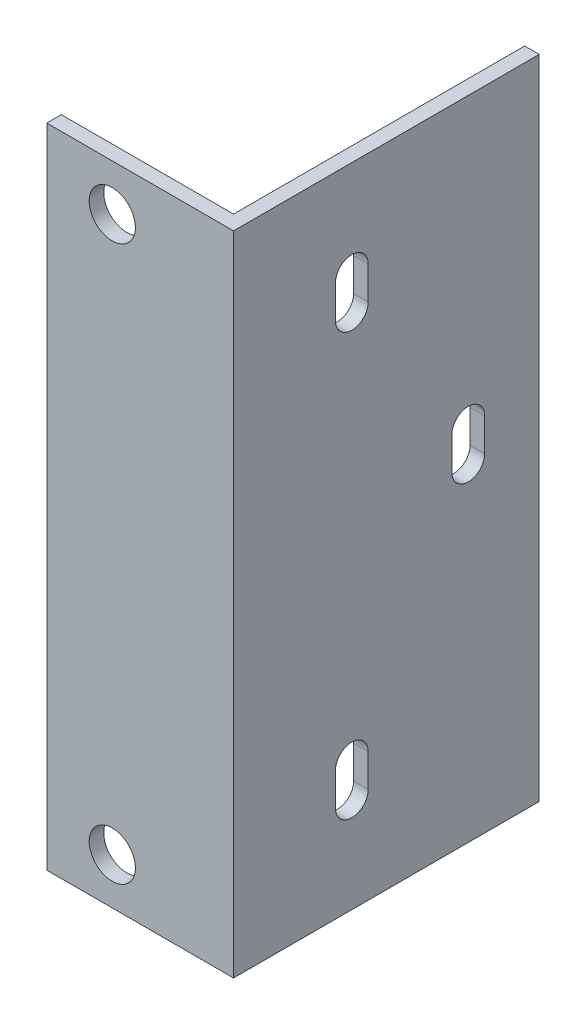
ISO-10303-21;
HEADER;
FILE_DESCRIPTION(('STEP AP214'),'2;1');
FILE_NAME('part.step','',(''),(''),'','','');
FILE_SCHEMA(('AUTOMOTIVE_DESIGN { 1 0 10303 214 1 1 1 1 }'));
ENDSEC;
DATA;
#1=APPLICATION_CONTEXT('core data for automotive mechanical design processes');
#2=APPLICATION_PROTOCOL_DEFINITION('international standard','automotive_design',2000,#1);
#3=PRODUCT_CONTEXT('',#1,'mechanical');
#4=PRODUCT('Part','Part','',(#3));
#5=PRODUCT_RELATED_PRODUCT_CATEGORY('part','',(#4));
#6=PRODUCT_DEFINITION_FORMATION('','',#4);
#7=PRODUCT_DEFINITION_CONTEXT('part definition',#1,'design');
#8=PRODUCT_DEFINITION('design','',#6,#7);
#9=PRODUCT_DEFINITION_SHAPE('','',#8);
#10=(LENGTH_UNIT() NAMED_UNIT(*) SI_UNIT(.MILLI.,.METRE.));
#11=(NAMED_UNIT(*) PLANE_ANGLE_UNIT() SI_UNIT($,.RADIAN.));
#12=(NAMED_UNIT(*) SI_UNIT($,.STERADIAN.) SOLID_ANGLE_UNIT());
#13=UNCERTAINTY_MEASURE_WITH_UNIT(LENGTH_MEASURE(1.E-05),#10,'distance_accuracy_value','');
#14=(GEOMETRIC_REPRESENTATION_CONTEXT(3) GLOBAL_UNCERTAINTY_ASSIGNED_CONTEXT((#13)) GLOBAL_UNIT_ASSIGNED_CONTEXT((#10,
#11,#12)) REPRESENTATION_CONTEXT('',''));
#15=CARTESIAN_POINT('',(0.,0.,0.));
#16=DIRECTION('',(0.,0.,1.));
#17=DIRECTION('',(1.,0.,0.));
#18=AXIS2_PLACEMENT_3D('',#15,#16,#17);
#19=CARTESIAN_POINT('',(0.,0.,-2.));
#20=DIRECTION('',(0.,0.,1.));
#21=DIRECTION('',(1.,0.,0.));
#22=AXIS2_PLACEMENT_3D('',#19,#20,#21);
#23=PLANE('',#22);
#24=CARTESIAN_POINT('',(0.,38.1,-2.));
#25=DIRECTION('',(0.,0.,1.));
#26=DIRECTION('',(1.,0.,0.));
#27=AXIS2_PLACEMENT_3D('',#24,#25,#26);
#28=CIRCLE('',#27,3.175);
#29=CARTESIAN_POINT('',(3.17500000000001,38.1,-2.));
#30=VERTEX_POINT('',#29);
#31=EDGE_CURVE('E267',#30,#30,#28,.F.);
#32=ORIENTED_EDGE('',*,*,#31,.F.);
#33=EDGE_LOOP('',(#32));
#34=FACE_BOUND('',#33,.T.);
#35=CARTESIAN_POINT('',(0.,-38.1,-2.));
#36=DIRECTION('',(0.,0.,1.));
#37=DIRECTION('',(1.,0.,0.));
#38=AXIS2_PLACEMENT_3D('',#35,#36,#37);
#39=CIRCLE('',#38,3.175);
#40=CARTESIAN_POINT('',(3.17500000000001,-38.1,-2.));
#41=VERTEX_POINT('',#40);
#42=EDGE_CURVE('E270',#41,#41,#39,.T.);
#43=ORIENTED_EDGE('',*,*,#42,.T.);
#44=EDGE_LOOP('',(#43));
#45=FACE_BOUND('',#44,.T.);
#46=DIRECTION('',(0.,1.,0.));
#47=VECTOR('',#46,1.);
#48=CARTESIAN_POINT('',(14.6624,44.45,-2.));
#49=LINE('',#48,#47);
#50=CARTESIAN_POINT('',(14.6624,-44.45,-2.));
#51=VERTEX_POINT('',#50);
#52=CARTESIAN_POINT('',(14.6624,44.45,-2.));
#53=VERTEX_POINT('',#52);
#54=EDGE_CURVE('E198',#51,#53,#49,.T.);
#55=ORIENTED_EDGE('',*,*,#54,.F.);
#56=DIRECTION('',(1.,0.,0.));
#57=VECTOR('',#56,1.);
#58=CARTESIAN_POINT('',(0.,-44.45,-2.));
#59=LINE('',#58,#57);
#60=CARTESIAN_POINT('',(-8.99999999999998,-44.45,-2.));
#61=VERTEX_POINT('',#60);
#62=EDGE_CURVE('E264',#61,#51,#59,.T.);
#63=ORIENTED_EDGE('',*,*,#62,.F.);
#64=DIRECTION('',(0.,-1.,0.));
#65=VECTOR('',#64,1.);
#66=CARTESIAN_POINT('',(-8.99999999999998,0.,-2.));
#67=LINE('',#66,#65);
#68=CARTESIAN_POINT('',(-8.99999999999999,44.45,-2.));
#69=VERTEX_POINT('',#68);
#70=EDGE_CURVE('E258',#69,#61,#67,.T.);
#71=ORIENTED_EDGE('',*,*,#70,.F.);
#72=DIRECTION('',(1.,0.,0.));
#73=VECTOR('',#72,1.);
#74=CARTESIAN_POINT('',(0.,44.45,-2.));
#75=LINE('',#74,#73);
#76=EDGE_CURVE('E259',#69,#53,#75,.T.);
#77=ORIENTED_EDGE('',*,*,#76,.T.);
#78=EDGE_LOOP('',(#55,#63,#71,#77));
#79=FACE_BOUND('',#78,.T.);
#80=ADVANCED_FACE('F43',(#34,#45,#79),#23,.F.);
#81=CARTESIAN_POINT('',(16.6624,0.,-2.));
#82=DIRECTION('',(-1.,0.,0.));
#83=DIRECTION('',(0.,-1.,0.));
#84=AXIS2_PLACEMENT_3D('',#81,#82,#83);
#85=PLANE('',#84);
#86=DIRECTION('',(0.,1.,0.));
#87=VECTOR('',#86,1.);
#88=CARTESIAN_POINT('',(16.6624,26.75,-18.5));
#89=LINE('',#88,#87);
#90=CARTESIAN_POINT('',(16.6624,26.75,-18.5));
#91=VERTEX_POINT('',#90);
#92=CARTESIAN_POINT('',(16.6624,31.25,-18.5));
#93=VERTEX_POINT('',#92);
#94=EDGE_CURVE('E184',#91,#93,#89,.T.);
#95=ORIENTED_EDGE('',*,*,#94,.F.);
#96=CARTESIAN_POINT('',(16.6624,26.75,-16.25));
#97=DIRECTION('',(1.,0.,0.));
#98=DIRECTION('',(0.,-1.,0.));
#99=AXIS2_PLACEMENT_3D('',#96,#97,#98);
#100=CIRCLE('',#99,2.25);
#101=CARTESIAN_POINT('',(16.6624,26.75,-14.));
#102=VERTEX_POINT('',#101);
#103=EDGE_CURVE('E59',#102,#91,#100,.T.);
#104=ORIENTED_EDGE('',*,*,#103,.F.);
#105=DIRECTION('',(0.,-1.,0.));
#106=VECTOR('',#105,1.);
#107=CARTESIAN_POINT('',(16.6624,26.75,-14.));
#108=LINE('',#107,#106);
#109=CARTESIAN_POINT('',(16.6624,31.25,-14.));
#110=VERTEX_POINT('',#109);
#111=EDGE_CURVE('E192',#110,#102,#108,.T.);
#112=ORIENTED_EDGE('',*,*,#111,.F.);
#113=CARTESIAN_POINT('',(16.6624,31.25,-16.25));
#114=DIRECTION('',(1.,0.,0.));
#115=DIRECTION('',(0.,-1.,0.));
#116=AXIS2_PLACEMENT_3D('',#113,#114,#115);
#117=CIRCLE('',#116,2.25);
#118=EDGE_CURVE('E174',#93,#110,#117,.T.);
#119=ORIENTED_EDGE('',*,*,#118,.F.);
#120=EDGE_LOOP('',(#95,#104,#112,#119));
#121=FACE_BOUND('',#120,.T.);
#122=DIRECTION('',(0.,-1.,0.));
#123=VECTOR('',#122,1.);
#124=CARTESIAN_POINT('',(16.6624,5.19999999999998,-30.));
#125=LINE('',#124,#123);
#126=CARTESIAN_POINT('',(16.6624,5.19999999999998,-30.));
#127=VERTEX_POINT('',#126);
#128=CARTESIAN_POINT('',(16.6624,0.699999999999978,-30.));
#129=VERTEX_POINT('',#128);
#130=EDGE_CURVE('E217',#127,#129,#125,.T.);
#131=ORIENTED_EDGE('',*,*,#130,.F.);
#132=CARTESIAN_POINT('',(16.6624,5.2,-32.25));
#133=DIRECTION('',(1.,0.,0.));
#134=DIRECTION('',(0.,1.,0.));
#135=AXIS2_PLACEMENT_3D('',#132,#133,#134);
#136=CIRCLE('',#135,2.25);
#137=CARTESIAN_POINT('',(16.6624,5.2,-34.5));
#138=VERTEX_POINT('',#137);
#139=EDGE_CURVE('E67',#138,#127,#136,.T.);
#140=ORIENTED_EDGE('',*,*,#139,.F.);
#141=DIRECTION('',(0.,1.,0.));
#142=VECTOR('',#141,1.);
#143=CARTESIAN_POINT('',(16.6624,5.2,-34.5));
#144=LINE('',#143,#142);
#145=CARTESIAN_POINT('',(16.6624,0.699999999999994,-34.5));
#146=VERTEX_POINT('',#145);
#147=EDGE_CURVE('E201',#146,#138,#144,.T.);
#148=ORIENTED_EDGE('',*,*,#147,.F.);
#149=CARTESIAN_POINT('',(16.6624,0.699999999999994,-32.25));
#150=DIRECTION('',(1.,0.,0.));
#151=DIRECTION('',(0.,1.,0.));
#152=AXIS2_PLACEMENT_3D('',#149,#150,#151);
#153=CIRCLE('',#152,2.25);
#154=EDGE_CURVE('E214',#129,#146,#153,.T.);
#155=ORIENTED_EDGE('',*,*,#154,.F.);
#156=EDGE_LOOP('',(#131,#140,#148,#155));
#157=FACE_BOUND('',#156,.T.);
#158=DIRECTION('',(0.,-1.,0.));
#159=VECTOR('',#158,1.);
#160=CARTESIAN_POINT('',(16.6624,-26.75,-14.));
#161=LINE('',#160,#159);
#162=CARTESIAN_POINT('',(16.6624,-26.75,-14.));
#163=VERTEX_POINT('',#162);
#164=CARTESIAN_POINT('',(16.6624,-31.25,-14.));
#165=VERTEX_POINT('',#164);
#166=EDGE_CURVE('E232',#163,#165,#161,.T.);
#167=ORIENTED_EDGE('',*,*,#166,.F.);
#168=CARTESIAN_POINT('',(16.6624,-26.75,-16.25));
#169=DIRECTION('',(1.,0.,0.));
#170=DIRECTION('',(0.,1.,0.));
#171=AXIS2_PLACEMENT_3D('',#168,#169,#170);
#172=CIRCLE('',#171,2.25);
#173=CARTESIAN_POINT('',(16.6624,-26.75,-18.5));
#174=VERTEX_POINT('',#173);
#175=EDGE_CURVE('E208',#174,#163,#172,.T.);
#176=ORIENTED_EDGE('',*,*,#175,.F.);
#177=DIRECTION('',(0.,1.,0.));
#178=VECTOR('',#177,1.);
#179=CARTESIAN_POINT('',(16.6624,-26.75,-18.5));
#180=LINE('',#179,#178);
#181=CARTESIAN_POINT('',(16.6624,-31.25,-18.5));
#182=VERTEX_POINT('',#181);
#183=EDGE_CURVE('E221',#182,#174,#180,.T.);
#184=ORIENTED_EDGE('',*,*,#183,.F.);
#185=CARTESIAN_POINT('',(16.6624,-31.25,-16.25));
#186=DIRECTION('',(1.,0.,0.));
#187=DIRECTION('',(0.,1.,0.));
#188=AXIS2_PLACEMENT_3D('',#185,#186,#187);
#189=CIRCLE('',#188,2.25);
#190=EDGE_CURVE('E235',#165,#182,#189,.T.);
#191=ORIENTED_EDGE('',*,*,#190,.F.);
#192=EDGE_LOOP('',(#167,#176,#184,#191));
#193=FACE_BOUND('',#192,.T.);
#194=DIRECTION('',(0.,-1.,0.));
#195=VECTOR('',#194,1.);
#196=CARTESIAN_POINT('',(16.6624,0.,0.));
#197=LINE('',#196,#195);
#198=CARTESIAN_POINT('',(16.6624,44.45,0.));
#199=VERTEX_POINT('',#198);
#200=CARTESIAN_POINT('',(16.6624,-44.45,0.));
#201=VERTEX_POINT('',#200);
#202=EDGE_CURVE('E260',#199,#201,#197,.T.);
#203=ORIENTED_EDGE('',*,*,#202,.T.);
#204=DIRECTION('',(0.,0.,1.));
#205=VECTOR('',#204,1.);
#206=CARTESIAN_POINT('',(16.6624,-44.45,-2.));
#207=LINE('',#206,#205);
#208=CARTESIAN_POINT('',(16.6624,-44.45,-42.));
#209=VERTEX_POINT('',#208);
#210=EDGE_CURVE('E289',#209,#201,#207,.T.);
#211=ORIENTED_EDGE('',*,*,#210,.F.);
#212=DIRECTION('',(0.,-1.,0.));
#213=VECTOR('',#212,1.);
#214=CARTESIAN_POINT('',(16.6624,44.45,-42.));
#215=LINE('',#214,#213);
#216=CARTESIAN_POINT('',(16.6624,44.45,-42.));
#217=VERTEX_POINT('',#216);
#218=EDGE_CURVE('E237',#217,#209,#215,.T.);
#219=ORIENTED_EDGE('',*,*,#218,.F.);
#220=DIRECTION('',(0.,0.,1.));
#221=VECTOR('',#220,1.);
#222=CARTESIAN_POINT('',(16.6624,44.45,-2.));
#223=LINE('',#222,#221);
#224=EDGE_CURVE('E271',#217,#199,#223,.T.);
#225=ORIENTED_EDGE('',*,*,#224,.T.);
#226=EDGE_LOOP('',(#203,#211,#219,#225));
#227=FACE_BOUND('',#226,.T.);
#228=ADVANCED_FACE('F44',(#121,#157,#193,#227),#85,.F.);
#229=CARTESIAN_POINT('',(0.,-44.45,-2.));
#230=DIRECTION('',(0.,-1.,0.));
#231=DIRECTION('',(1.,0.,0.));
#232=AXIS2_PLACEMENT_3D('',#229,#230,#231);
#233=PLANE('',#232);
#234=DIRECTION('',(1.,0.,0.));
#235=VECTOR('',#234,1.);
#236=CARTESIAN_POINT('',(0.,-44.45,0.));
#237=LINE('',#236,#235);
#238=CARTESIAN_POINT('',(-8.99999999999998,-44.45,0.));
#239=VERTEX_POINT('',#238);
#240=EDGE_CURVE('E282',#239,#201,#237,.T.);
#241=ORIENTED_EDGE('',*,*,#240,.F.);
#242=DIRECTION('',(0.,0.,1.));
#243=VECTOR('',#242,1.);
#244=CARTESIAN_POINT('',(-8.99999999999998,-44.45,-2.));
#245=LINE('',#244,#243);
#246=EDGE_CURVE('E292',#61,#239,#245,.T.);
#247=ORIENTED_EDGE('',*,*,#246,.F.);
#248=ORIENTED_EDGE('',*,*,#62,.T.);
#249=DIRECTION('',(0.,0.,1.));
#250=VECTOR('',#249,1.);
#251=CARTESIAN_POINT('',(14.6624,-44.45,-42.));
#252=LINE('',#251,#250);
#253=CARTESIAN_POINT('',(14.6624,-44.45,-42.));
#254=VERTEX_POINT('',#253);
#255=EDGE_CURVE('E251',#254,#51,#252,.T.);
#256=ORIENTED_EDGE('',*,*,#255,.F.);
#257=DIRECTION('',(-1.,0.,0.));
#258=VECTOR('',#257,1.);
#259=CARTESIAN_POINT('',(16.6624,-44.45,-42.));
#260=LINE('',#259,#258);
#261=EDGE_CURVE('E245',#209,#254,#260,.T.);
#262=ORIENTED_EDGE('',*,*,#261,.F.);
#263=ORIENTED_EDGE('',*,*,#210,.T.);
#264=EDGE_LOOP('',(#241,#247,#248,#256,#262,#263));
#265=FACE_BOUND('',#264,.T.);
#266=ADVANCED_FACE('F355',(#265),#233,.T.);
#267=CARTESIAN_POINT('',(-8.99999999999998,0.,-2.));
#268=DIRECTION('',(-1.,0.,0.));
#269=DIRECTION('',(0.,-1.,0.));
#270=AXIS2_PLACEMENT_3D('',#267,#268,#269);
#271=PLANE('',#270);
#272=DIRECTION('',(0.,-1.,0.));
#273=VECTOR('',#272,1.);
#274=CARTESIAN_POINT('',(-8.99999999999998,0.,0.));
#275=LINE('',#274,#273);
#276=CARTESIAN_POINT('',(-8.99999999999999,44.45,0.));
#277=VERTEX_POINT('',#276);
#278=EDGE_CURVE('E279',#277,#239,#275,.T.);
#279=ORIENTED_EDGE('',*,*,#278,.F.);
#280=DIRECTION('',(0.,0.,1.));
#281=VECTOR('',#280,1.);
#282=CARTESIAN_POINT('',(-8.99999999999999,44.45,-2.));
#283=LINE('',#282,#281);
#284=EDGE_CURVE('E295',#69,#277,#283,.T.);
#285=ORIENTED_EDGE('',*,*,#284,.F.);
#286=ORIENTED_EDGE('',*,*,#70,.T.);
#287=ORIENTED_EDGE('',*,*,#246,.T.);
#288=EDGE_LOOP('',(#279,#285,#286,#287));
#289=FACE_BOUND('',#288,.T.);
#290=ADVANCED_FACE('F367',(#289),#271,.T.);
#291=CARTESIAN_POINT('',(0.,-38.1,-2.));
#292=DIRECTION('',(0.,0.,1.));
#293=DIRECTION('',(1.,0.,0.));
#294=AXIS2_PLACEMENT_3D('',#291,#292,#293);
#295=CYLINDRICAL_SURFACE('',#294,3.175);
#296=ORIENTED_EDGE('',*,*,#42,.F.);
#297=EDGE_LOOP('',(#296));
#298=FACE_BOUND('',#297,.T.);
#299=CARTESIAN_POINT('',(0.,-38.1,0.));
#300=DIRECTION('',(0.,0.,1.));
#301=DIRECTION('',(1.,0.,0.));
#302=AXIS2_PLACEMENT_3D('',#299,#300,#301);
#303=CIRCLE('',#302,3.175);
#304=CARTESIAN_POINT('',(3.17500000000001,-38.1,0.));
#305=VERTEX_POINT('',#304);
#306=EDGE_CURVE('E284',#305,#305,#303,.T.);
#307=ORIENTED_EDGE('',*,*,#306,.T.);
#308=EDGE_LOOP('',(#307));
#309=FACE_BOUND('',#308,.T.);
#310=ADVANCED_FACE('F366',(#298,#309),#295,.F.);
#311=CARTESIAN_POINT('',(0.,44.45,-2.));
#312=DIRECTION('',(0.,-1.,0.));
#313=DIRECTION('',(1.,0.,0.));
#314=AXIS2_PLACEMENT_3D('',#311,#312,#313);
#315=PLANE('',#314);
#316=DIRECTION('',(1.,0.,0.));
#317=VECTOR('',#316,1.);
#318=CARTESIAN_POINT('',(0.,44.45,0.));
#319=LINE('',#318,#317);
#320=EDGE_CURVE('E277',#277,#199,#319,.T.);
#321=ORIENTED_EDGE('',*,*,#320,.T.);
#322=ORIENTED_EDGE('',*,*,#224,.F.);
#323=DIRECTION('',(1.,0.,0.));
#324=VECTOR('',#323,1.);
#325=CARTESIAN_POINT('',(16.6624,44.45,-42.));
#326=LINE('',#325,#324);
#327=CARTESIAN_POINT('',(14.6624,44.45,-42.));
#328=VERTEX_POINT('',#327);
#329=EDGE_CURVE('E246',#328,#217,#326,.T.);
#330=ORIENTED_EDGE('',*,*,#329,.F.);
#331=DIRECTION('',(0.,0.,1.));
#332=VECTOR('',#331,1.);
#333=CARTESIAN_POINT('',(14.6624,44.45,-42.));
#334=LINE('',#333,#332);
#335=EDGE_CURVE('E248',#328,#53,#334,.T.);
#336=ORIENTED_EDGE('',*,*,#335,.T.);
#337=ORIENTED_EDGE('',*,*,#76,.F.);
#338=ORIENTED_EDGE('',*,*,#284,.T.);
#339=EDGE_LOOP('',(#321,#322,#330,#336,#337,#338));
#340=FACE_BOUND('',#339,.T.);
#341=ADVANCED_FACE('F364',(#340),#315,.F.);
#342=CARTESIAN_POINT('',(0.,38.1,-2.));
#343=DIRECTION('',(0.,0.,1.));
#344=DIRECTION('',(1.,0.,0.));
#345=AXIS2_PLACEMENT_3D('',#342,#343,#344);
#346=CYLINDRICAL_SURFACE('',#345,3.175);
#347=ORIENTED_EDGE('',*,*,#31,.T.);
#348=EDGE_LOOP('',(#347));
#349=FACE_BOUND('',#348,.T.);
#350=CARTESIAN_POINT('',(0.,38.1,0.));
#351=DIRECTION('',(0.,0.,1.));
#352=DIRECTION('',(1.,0.,0.));
#353=AXIS2_PLACEMENT_3D('',#350,#351,#352);
#354=CIRCLE('',#353,3.175);
#355=CARTESIAN_POINT('',(3.17500000000001,38.1,0.));
#356=VERTEX_POINT('',#355);
#357=EDGE_CURVE('E262',#356,#356,#354,.F.);
#358=ORIENTED_EDGE('',*,*,#357,.F.);
#359=EDGE_LOOP('',(#358));
#360=FACE_BOUND('',#359,.T.);
#361=ADVANCED_FACE('F359',(#349,#360),#346,.F.);
#362=CARTESIAN_POINT('',(0.,0.,0.));
#363=DIRECTION('',(0.,0.,1.));
#364=DIRECTION('',(1.,0.,0.));
#365=AXIS2_PLACEMENT_3D('',#362,#363,#364);
#366=PLANE('',#365);
#367=ORIENTED_EDGE('',*,*,#202,.F.);
#368=ORIENTED_EDGE('',*,*,#320,.F.);
#369=ORIENTED_EDGE('',*,*,#278,.T.);
#370=ORIENTED_EDGE('',*,*,#240,.T.);
#371=EDGE_LOOP('',(#367,#368,#369,#370));
#372=FACE_BOUND('',#371,.T.);
#373=ORIENTED_EDGE('',*,*,#306,.F.);
#374=EDGE_LOOP('',(#373));
#375=FACE_BOUND('',#374,.T.);
#376=ORIENTED_EDGE('',*,*,#357,.T.);
#377=EDGE_LOOP('',(#376));
#378=FACE_BOUND('',#377,.T.);
#379=ADVANCED_FACE('F356',(#372,#375,#378),#366,.T.);
#380=CARTESIAN_POINT('',(14.6624,44.45,-42.));
#381=DIRECTION('',(1.,0.,0.));
#382=DIRECTION('',(0.,1.,0.));
#383=AXIS2_PLACEMENT_3D('',#380,#381,#382);
#384=PLANE('',#383);
#385=DIRECTION('',(0.,-1.,0.));
#386=VECTOR('',#385,1.);
#387=CARTESIAN_POINT('',(14.6624,44.45,-14.));
#388=LINE('',#387,#386);
#389=CARTESIAN_POINT('',(14.6624,31.25,-14.));
#390=VERTEX_POINT('',#389);
#391=CARTESIAN_POINT('',(14.6624,26.75,-14.));
#392=VERTEX_POINT('',#391);
#393=EDGE_CURVE('E51',#390,#392,#388,.T.);
#394=ORIENTED_EDGE('',*,*,#393,.T.);
#395=CARTESIAN_POINT('',(14.6624,26.75,-16.25));
#396=DIRECTION('',(1.,0.,0.));
#397=DIRECTION('',(0.,1.,0.));
#398=AXIS2_PLACEMENT_3D('',#395,#396,#397);
#399=CIRCLE('',#398,2.25);
#400=CARTESIAN_POINT('',(14.6624,26.75,-18.5));
#401=VERTEX_POINT('',#400);
#402=EDGE_CURVE('E11',#392,#401,#399,.T.);
#403=ORIENTED_EDGE('',*,*,#402,.T.);
#404=DIRECTION('',(0.,1.,0.));
#405=VECTOR('',#404,1.);
#406=CARTESIAN_POINT('',(14.6624,44.45,-18.5));
#407=LINE('',#406,#405);
#408=CARTESIAN_POINT('',(14.6624,31.25,-18.5));
#409=VERTEX_POINT('',#408);
#410=EDGE_CURVE('E322',#401,#409,#407,.T.);
#411=ORIENTED_EDGE('',*,*,#410,.T.);
#412=CARTESIAN_POINT('',(14.6624,31.25,-16.25));
#413=DIRECTION('',(1.,0.,0.));
#414=DIRECTION('',(0.,1.,0.));
#415=AXIS2_PLACEMENT_3D('',#412,#413,#414);
#416=CIRCLE('',#415,2.25);
#417=EDGE_CURVE('E178',#409,#390,#416,.T.);
#418=ORIENTED_EDGE('',*,*,#417,.T.);
#419=EDGE_LOOP('',(#394,#403,#411,#418));
#420=FACE_BOUND('',#419,.T.);
#421=DIRECTION('',(0.,1.,0.));
#422=VECTOR('',#421,1.);
#423=CARTESIAN_POINT('',(14.6624,44.45,-34.5));
#424=LINE('',#423,#422);
#425=CARTESIAN_POINT('',(14.6624,0.699999999999994,-34.5));
#426=VERTEX_POINT('',#425);
#427=CARTESIAN_POINT('',(14.6624,5.2,-34.5));
#428=VERTEX_POINT('',#427);
#429=EDGE_CURVE('E314',#426,#428,#424,.T.);
#430=ORIENTED_EDGE('',*,*,#429,.T.);
#431=CARTESIAN_POINT('',(14.6624,5.2,-32.25));
#432=DIRECTION('',(1.,0.,0.));
#433=DIRECTION('',(0.,1.,0.));
#434=AXIS2_PLACEMENT_3D('',#431,#432,#433);
#435=CIRCLE('',#434,2.25);
#436=CARTESIAN_POINT('',(14.6624,5.19999999999998,-30.));
#437=VERTEX_POINT('',#436);
#438=EDGE_CURVE('E319',#428,#437,#435,.T.);
#439=ORIENTED_EDGE('',*,*,#438,.T.);
#440=DIRECTION('',(0.,-1.,0.));
#441=VECTOR('',#440,1.);
#442=CARTESIAN_POINT('',(14.6624,44.45,-30.));
#443=LINE('',#442,#441);
#444=CARTESIAN_POINT('',(14.6624,0.699999999999978,-30.));
#445=VERTEX_POINT('',#444);
#446=EDGE_CURVE('E307',#437,#445,#443,.T.);
#447=ORIENTED_EDGE('',*,*,#446,.T.);
#448=CARTESIAN_POINT('',(14.6624,0.699999999999994,-32.25));
#449=DIRECTION('',(1.,0.,0.));
#450=DIRECTION('',(0.,1.,0.));
#451=AXIS2_PLACEMENT_3D('',#448,#449,#450);
#452=CIRCLE('',#451,2.25);
#453=EDGE_CURVE('E315',#445,#426,#452,.T.);
#454=ORIENTED_EDGE('',*,*,#453,.T.);
#455=EDGE_LOOP('',(#430,#439,#447,#454));
#456=FACE_BOUND('',#455,.T.);
#457=DIRECTION('',(0.,1.,0.));
#458=VECTOR('',#457,1.);
#459=CARTESIAN_POINT('',(14.6624,44.45,-18.5));
#460=LINE('',#459,#458);
#461=CARTESIAN_POINT('',(14.6624,-31.25,-18.5));
#462=VERTEX_POINT('',#461);
#463=CARTESIAN_POINT('',(14.6624,-26.75,-18.5));
#464=VERTEX_POINT('',#463);
#465=EDGE_CURVE('E303',#462,#464,#460,.T.);
#466=ORIENTED_EDGE('',*,*,#465,.T.);
#467=CARTESIAN_POINT('',(14.6624,-26.75,-16.25));
#468=DIRECTION('',(1.,0.,0.));
#469=DIRECTION('',(0.,1.,0.));
#470=AXIS2_PLACEMENT_3D('',#467,#468,#469);
#471=CIRCLE('',#470,2.25);
#472=CARTESIAN_POINT('',(14.6624,-26.75,-14.));
#473=VERTEX_POINT('',#472);
#474=EDGE_CURVE('E306',#464,#473,#471,.T.);
#475=ORIENTED_EDGE('',*,*,#474,.T.);
#476=DIRECTION('',(0.,-1.,0.));
#477=VECTOR('',#476,1.);
#478=CARTESIAN_POINT('',(14.6624,44.45,-14.));
#479=LINE('',#478,#477);
#480=CARTESIAN_POINT('',(14.6624,-31.25,-14.));
#481=VERTEX_POINT('',#480);
#482=EDGE_CURVE('E293',#473,#481,#479,.T.);
#483=ORIENTED_EDGE('',*,*,#482,.T.);
#484=CARTESIAN_POINT('',(14.6624,-31.25,-16.25));
#485=DIRECTION('',(1.,0.,0.));
#486=DIRECTION('',(0.,1.,0.));
#487=AXIS2_PLACEMENT_3D('',#484,#485,#486);
#488=CIRCLE('',#487,2.25);
#489=EDGE_CURVE('E297',#481,#462,#488,.T.);
#490=ORIENTED_EDGE('',*,*,#489,.T.);
#491=EDGE_LOOP('',(#466,#475,#483,#490));
#492=FACE_BOUND('',#491,.T.);
#493=ORIENTED_EDGE('',*,*,#54,.T.);
#494=ORIENTED_EDGE('',*,*,#335,.F.);
#495=DIRECTION('',(0.,1.,0.));
#496=VECTOR('',#495,1.);
#497=CARTESIAN_POINT('',(14.6624,44.45,-42.));
#498=LINE('',#497,#496);
#499=EDGE_CURVE('E242',#254,#328,#498,.T.);
#500=ORIENTED_EDGE('',*,*,#499,.F.);
#501=ORIENTED_EDGE('',*,*,#255,.T.);
#502=EDGE_LOOP('',(#493,#494,#500,#501));
#503=FACE_BOUND('',#502,.T.);
#504=ADVANCED_FACE('F323',(#420,#456,#492,#503),#384,.F.);
#505=CARTESIAN_POINT('',(0.,0.,-42.));
#506=DIRECTION('',(0.,0.,-1.));
#507=DIRECTION('',(-1.,0.,0.));
#508=AXIS2_PLACEMENT_3D('',#505,#506,#507);
#509=PLANE('',#508);
#510=ORIENTED_EDGE('',*,*,#218,.T.);
#511=ORIENTED_EDGE('',*,*,#261,.T.);
#512=ORIENTED_EDGE('',*,*,#499,.T.);
#513=ORIENTED_EDGE('',*,*,#329,.T.);
#514=EDGE_LOOP('',(#510,#511,#512,#513));
#515=FACE_BOUND('',#514,.T.);
#516=ADVANCED_FACE('F393',(#515),#509,.T.);
#517=CARTESIAN_POINT('',(-3.33759999999999,-26.75,-16.25));
#518=DIRECTION('',(1.,0.,0.));
#519=DIRECTION('',(0.,1.,0.));
#520=AXIS2_PLACEMENT_3D('',#517,#518,#519);
#521=CYLINDRICAL_SURFACE('',#520,2.25);
#522=DIRECTION('',(1.,0.,0.));
#523=VECTOR('',#522,1.);
#524=CARTESIAN_POINT('',(-3.33759999999999,-26.75,-18.5));
#525=LINE('',#524,#523);
#526=EDGE_CURVE('E226',#464,#174,#525,.T.);
#527=ORIENTED_EDGE('',*,*,#526,.T.);
#528=ORIENTED_EDGE('',*,*,#175,.T.);
#529=DIRECTION('',(1.,0.,0.));
#530=VECTOR('',#529,1.);
#531=CARTESIAN_POINT('',(-3.33759999999999,-26.75,-14.));
#532=LINE('',#531,#530);
#533=EDGE_CURVE('E216',#473,#163,#532,.T.);
#534=ORIENTED_EDGE('',*,*,#533,.F.);
#535=ORIENTED_EDGE('',*,*,#474,.F.);
#536=EDGE_LOOP('',(#527,#528,#534,#535));
#537=FACE_BOUND('',#536,.T.);
#538=ADVANCED_FACE('F401',(#537),#521,.F.);
#539=CARTESIAN_POINT('',(-3.33759999999999,-26.75,-18.5));
#540=DIRECTION('',(0.,0.,-1.));
#541=DIRECTION('',(-1.,0.,0.));
#542=AXIS2_PLACEMENT_3D('',#539,#540,#541);
#543=PLANE('',#542);
#544=DIRECTION('',(1.,0.,0.));
#545=VECTOR('',#544,1.);
#546=CARTESIAN_POINT('',(-3.33759999999999,-31.25,-18.5));
#547=LINE('',#546,#545);
#548=EDGE_CURVE('E228',#462,#182,#547,.T.);
#549=ORIENTED_EDGE('',*,*,#548,.T.);
#550=ORIENTED_EDGE('',*,*,#183,.T.);
#551=ORIENTED_EDGE('',*,*,#526,.F.);
#552=ORIENTED_EDGE('',*,*,#465,.F.);
#553=EDGE_LOOP('',(#549,#550,#551,#552));
#554=FACE_BOUND('',#553,.T.);
#555=ADVANCED_FACE('F407',(#554),#543,.F.);
#556=CARTESIAN_POINT('',(-3.33759999999999,-31.25,-16.25));
#557=DIRECTION('',(1.,0.,0.));
#558=DIRECTION('',(0.,1.,0.));
#559=AXIS2_PLACEMENT_3D('',#556,#557,#558);
#560=CYLINDRICAL_SURFACE('',#559,2.25);
#561=DIRECTION('',(1.,0.,0.));
#562=VECTOR('',#561,1.);
#563=CARTESIAN_POINT('',(-3.33759999999999,-31.25,-14.));
#564=LINE('',#563,#562);
#565=EDGE_CURVE('E224',#481,#165,#564,.T.);
#566=ORIENTED_EDGE('',*,*,#565,.T.);
#567=ORIENTED_EDGE('',*,*,#190,.T.);
#568=ORIENTED_EDGE('',*,*,#548,.F.);
#569=ORIENTED_EDGE('',*,*,#489,.F.);
#570=EDGE_LOOP('',(#566,#567,#568,#569));
#571=FACE_BOUND('',#570,.T.);
#572=ADVANCED_FACE('F415',(#571),#560,.F.);
#573=CARTESIAN_POINT('',(-3.33759999999999,-26.75,-14.));
#574=DIRECTION('',(0.,0.,1.));
#575=DIRECTION('',(1.,0.,0.));
#576=AXIS2_PLACEMENT_3D('',#573,#574,#575);
#577=PLANE('',#576);
#578=ORIENTED_EDGE('',*,*,#533,.T.);
#579=ORIENTED_EDGE('',*,*,#166,.T.);
#580=ORIENTED_EDGE('',*,*,#565,.F.);
#581=ORIENTED_EDGE('',*,*,#482,.F.);
#582=EDGE_LOOP('',(#578,#579,#580,#581));
#583=FACE_BOUND('',#582,.T.);
#584=ADVANCED_FACE('F418',(#583),#577,.F.);
#585=CARTESIAN_POINT('',(-3.33759999999999,5.2,-32.25));
#586=DIRECTION('',(1.,0.,0.));
#587=DIRECTION('',(0.,1.,0.));
#588=AXIS2_PLACEMENT_3D('',#585,#586,#587);
#589=CYLINDRICAL_SURFACE('',#588,2.25);
#590=DIRECTION('',(1.,0.,0.));
#591=VECTOR('',#590,1.);
#592=CARTESIAN_POINT('',(-3.33759999999999,5.2,-34.5));
#593=LINE('',#592,#591);
#594=EDGE_CURVE('E206',#428,#138,#593,.T.);
#595=ORIENTED_EDGE('',*,*,#594,.T.);
#596=ORIENTED_EDGE('',*,*,#139,.T.);
#597=DIRECTION('',(1.,0.,0.));
#598=VECTOR('',#597,1.);
#599=CARTESIAN_POINT('',(-3.33759999999999,5.19999999999998,-30.));
#600=LINE('',#599,#598);
#601=EDGE_CURVE('E203',#437,#127,#600,.T.);
#602=ORIENTED_EDGE('',*,*,#601,.F.);
#603=ORIENTED_EDGE('',*,*,#438,.F.);
#604=EDGE_LOOP('',(#595,#596,#602,#603));
#605=FACE_BOUND('',#604,.T.);
#606=ADVANCED_FACE('F419',(#605),#589,.F.);
#607=CARTESIAN_POINT('',(-3.33759999999999,5.2,-34.5));
#608=DIRECTION('',(0.,0.,-1.));
#609=DIRECTION('',(-1.,0.,0.));
#610=AXIS2_PLACEMENT_3D('',#607,#608,#609);
#611=PLANE('',#610);
#612=DIRECTION('',(1.,0.,0.));
#613=VECTOR('',#612,1.);
#614=CARTESIAN_POINT('',(-3.33759999999999,0.699999999999991,-34.5));
#615=LINE('',#614,#613);
#616=EDGE_CURVE('E207',#426,#146,#615,.T.);
#617=ORIENTED_EDGE('',*,*,#616,.T.);
#618=ORIENTED_EDGE('',*,*,#147,.T.);
#619=ORIENTED_EDGE('',*,*,#594,.F.);
#620=ORIENTED_EDGE('',*,*,#429,.F.);
#621=EDGE_LOOP('',(#617,#618,#619,#620));
#622=FACE_BOUND('',#621,.T.);
#623=ADVANCED_FACE('F422',(#622),#611,.F.);
#624=CARTESIAN_POINT('',(-3.33759999999999,0.699999999999991,-32.25));
#625=DIRECTION('',(1.,0.,0.));
#626=DIRECTION('',(0.,1.,0.));
#627=AXIS2_PLACEMENT_3D('',#624,#625,#626);
#628=CYLINDRICAL_SURFACE('',#627,2.25);
#629=DIRECTION('',(1.,0.,0.));
#630=VECTOR('',#629,1.);
#631=CARTESIAN_POINT('',(-3.33759999999999,0.699999999999976,-30.));
#632=LINE('',#631,#630);
#633=EDGE_CURVE('E204',#445,#129,#632,.T.);
#634=ORIENTED_EDGE('',*,*,#633,.T.);
#635=ORIENTED_EDGE('',*,*,#154,.T.);
#636=ORIENTED_EDGE('',*,*,#616,.F.);
#637=ORIENTED_EDGE('',*,*,#453,.F.);
#638=EDGE_LOOP('',(#634,#635,#636,#637));
#639=FACE_BOUND('',#638,.T.);
#640=ADVANCED_FACE('F339',(#639),#628,.F.);
#641=CARTESIAN_POINT('',(-3.33759999999999,5.19999999999998,-30.));
#642=DIRECTION('',(0.,0.,1.));
#643=DIRECTION('',(1.,0.,0.));
#644=AXIS2_PLACEMENT_3D('',#641,#642,#643);
#645=PLANE('',#644);
#646=ORIENTED_EDGE('',*,*,#601,.T.);
#647=ORIENTED_EDGE('',*,*,#130,.T.);
#648=ORIENTED_EDGE('',*,*,#633,.F.);
#649=ORIENTED_EDGE('',*,*,#446,.F.);
#650=EDGE_LOOP('',(#646,#647,#648,#649));
#651=FACE_BOUND('',#650,.T.);
#652=ADVANCED_FACE('F335',(#651),#645,.F.);
#653=CARTESIAN_POINT('',(-3.3376,26.75,-16.25));
#654=DIRECTION('',(1.,0.,0.));
#655=DIRECTION('',(0.,1.,0.));
#656=AXIS2_PLACEMENT_3D('',#653,#654,#655);
#657=CYLINDRICAL_SURFACE('',#656,2.25);
#658=DIRECTION('',(1.,0.,0.));
#659=VECTOR('',#658,1.);
#660=CARTESIAN_POINT('',(-3.3376,26.75,-14.));
#661=LINE('',#660,#659);
#662=EDGE_CURVE('E197',#392,#102,#661,.T.);
#663=ORIENTED_EDGE('',*,*,#662,.T.);
#664=ORIENTED_EDGE('',*,*,#103,.T.);
#665=DIRECTION('',(1.,0.,0.));
#666=VECTOR('',#665,1.);
#667=CARTESIAN_POINT('',(-3.3376,26.75,-18.5));
#668=LINE('',#667,#666);
#669=EDGE_CURVE('E185',#401,#91,#668,.T.);
#670=ORIENTED_EDGE('',*,*,#669,.F.);
#671=ORIENTED_EDGE('',*,*,#402,.F.);
#672=EDGE_LOOP('',(#663,#664,#670,#671));
#673=FACE_BOUND('',#672,.T.);
#674=ADVANCED_FACE('F326',(#673),#657,.F.);
#675=CARTESIAN_POINT('',(-3.3376,26.75,-14.));
#676=DIRECTION('',(0.,0.,1.));
#677=DIRECTION('',(1.,0.,0.));
#678=AXIS2_PLACEMENT_3D('',#675,#676,#677);
#679=PLANE('',#678);
#680=DIRECTION('',(1.,0.,0.));
#681=VECTOR('',#680,1.);
#682=CARTESIAN_POINT('',(-3.3376,31.25,-14.));
#683=LINE('',#682,#681);
#684=EDGE_CURVE('E181',#390,#110,#683,.T.);
#685=ORIENTED_EDGE('',*,*,#684,.T.);
#686=ORIENTED_EDGE('',*,*,#111,.T.);
#687=ORIENTED_EDGE('',*,*,#662,.F.);
#688=ORIENTED_EDGE('',*,*,#393,.F.);
#689=EDGE_LOOP('',(#685,#686,#687,#688));
#690=FACE_BOUND('',#689,.T.);
#691=ADVANCED_FACE('F329',(#690),#679,.F.);
#692=CARTESIAN_POINT('',(-3.3376,31.25,-16.25));
#693=DIRECTION('',(1.,0.,0.));
#694=DIRECTION('',(0.,1.,0.));
#695=AXIS2_PLACEMENT_3D('',#692,#693,#694);
#696=CYLINDRICAL_SURFACE('',#695,2.25);
#697=DIRECTION('',(1.,0.,0.));
#698=VECTOR('',#697,1.);
#699=CARTESIAN_POINT('',(-3.3376,31.25,-18.5));
#700=LINE('',#699,#698);
#701=EDGE_CURVE('E167',#409,#93,#700,.T.);
#702=ORIENTED_EDGE('',*,*,#701,.T.);
#703=ORIENTED_EDGE('',*,*,#118,.T.);
#704=ORIENTED_EDGE('',*,*,#684,.F.);
#705=ORIENTED_EDGE('',*,*,#417,.F.);
#706=EDGE_LOOP('',(#702,#703,#704,#705));
#707=FACE_BOUND('',#706,.T.);
#708=ADVANCED_FACE('F175',(#707),#696,.F.);
#709=CARTESIAN_POINT('',(-3.3376,26.75,-18.5));
#710=DIRECTION('',(0.,0.,-1.));
#711=DIRECTION('',(-1.,0.,0.));
#712=AXIS2_PLACEMENT_3D('',#709,#710,#711);
#713=PLANE('',#712);
#714=ORIENTED_EDGE('',*,*,#669,.T.);
#715=ORIENTED_EDGE('',*,*,#94,.T.);
#716=ORIENTED_EDGE('',*,*,#701,.F.);
#717=ORIENTED_EDGE('',*,*,#410,.F.);
#718=EDGE_LOOP('',(#714,#715,#716,#717));
#719=FACE_BOUND('',#718,.T.);
#720=ADVANCED_FACE('F187',(#719),#713,.F.);
#721=CLOSED_SHELL('',(#80,#228,#266,#290,#310,#341,#361,#379,#504,#516,#538,#555,#572,#584,#606,
#623,#640,#652,#674,#691,#708,#720));
#722=MANIFOLD_SOLID_BREP('B2',#721);
#723=ADVANCED_BREP_SHAPE_REPRESENTATION('',(#18,#722),#14);
#724=SHAPE_DEFINITION_REPRESENTATION(#9,#723);
ENDSEC;
END-ISO-10303-21;
